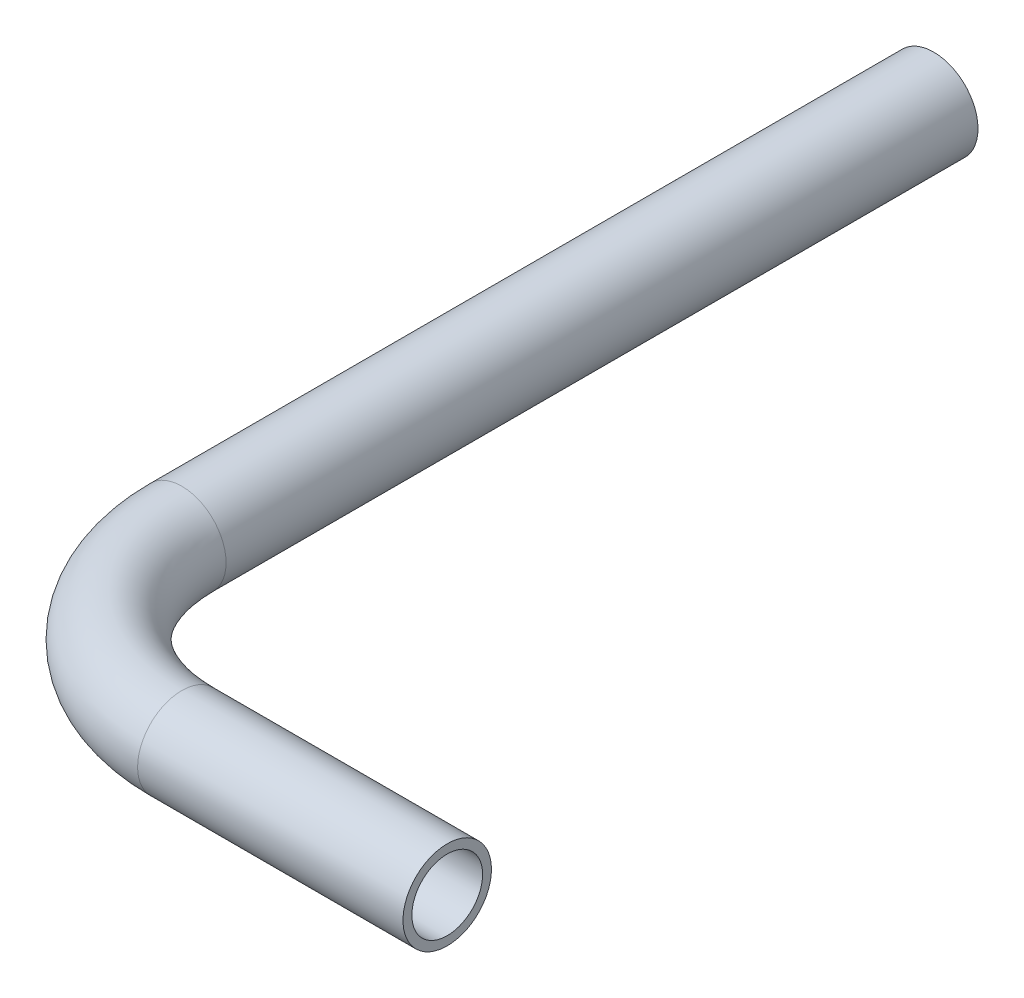
ISO-10303-21;
HEADER;
FILE_DESCRIPTION(('STEP AP214'),'2;1');
FILE_NAME('part.step','',(''),(''),'','','');
FILE_SCHEMA(('AUTOMOTIVE_DESIGN { 1 0 10303 214 1 1 1 1 }'));
ENDSEC;
DATA;
#1=APPLICATION_CONTEXT('core data for automotive mechanical design processes');
#2=APPLICATION_PROTOCOL_DEFINITION('international standard','automotive_design',2000,#1);
#3=PRODUCT_CONTEXT('',#1,'mechanical');
#4=PRODUCT('Part','Part','',(#3));
#5=PRODUCT_RELATED_PRODUCT_CATEGORY('part','',(#4));
#6=PRODUCT_DEFINITION_FORMATION('','',#4);
#7=PRODUCT_DEFINITION_CONTEXT('part definition',#1,'design');
#8=PRODUCT_DEFINITION('design','',#6,#7);
#9=PRODUCT_DEFINITION_SHAPE('','',#8);
#10=(LENGTH_UNIT() NAMED_UNIT(*) SI_UNIT(.MILLI.,.METRE.));
#11=(NAMED_UNIT(*) PLANE_ANGLE_UNIT() SI_UNIT($,.RADIAN.));
#12=(NAMED_UNIT(*) SI_UNIT($,.STERADIAN.) SOLID_ANGLE_UNIT());
#13=UNCERTAINTY_MEASURE_WITH_UNIT(LENGTH_MEASURE(1.E-05),#10,'distance_accuracy_value','');
#14=(GEOMETRIC_REPRESENTATION_CONTEXT(3) GLOBAL_UNCERTAINTY_ASSIGNED_CONTEXT((#13)) GLOBAL_UNIT_ASSIGNED_CONTEXT((#10,
#11,#12)) REPRESENTATION_CONTEXT('',''));
#15=CARTESIAN_POINT('',(0.,0.,0.));
#16=DIRECTION('',(0.,0.,1.));
#17=DIRECTION('',(1.,0.,0.));
#18=AXIS2_PLACEMENT_3D('',#15,#16,#17);
#19=CARTESIAN_POINT('',(0.,0.,0.));
#20=DIRECTION('',(0.,0.,1.));
#21=DIRECTION('',(1.,0.,0.));
#22=AXIS2_PLACEMENT_3D('',#19,#20,#21);
#23=PLANE('',#22);
#24=CARTESIAN_POINT('',(0.,0.,0.));
#25=DIRECTION('',(0.,0.,1.));
#26=DIRECTION('',(1.,0.,0.));
#27=AXIS2_PLACEMENT_3D('',#24,#25,#26);
#28=CIRCLE('',#27,5.08);
#29=CARTESIAN_POINT('',(5.08,0.,0.));
#30=VERTEX_POINT('',#29);
#31=EDGE_CURVE('E53',#30,#30,#28,.T.);
#32=ORIENTED_EDGE('',*,*,#31,.T.);
#33=EDGE_LOOP('',(#32));
#34=FACE_BOUND('',#33,.T.);
#35=CARTESIAN_POINT('',(0.,0.,0.));
#36=DIRECTION('',(0.,0.,1.));
#37=DIRECTION('',(1.,0.,0.));
#38=AXIS2_PLACEMENT_3D('',#35,#36,#37);
#39=CIRCLE('',#38,6.35);
#40=CARTESIAN_POINT('',(6.35,0.,0.));
#41=VERTEX_POINT('',#40);
#42=EDGE_CURVE('E44',#41,#41,#39,.T.);
#43=ORIENTED_EDGE('',*,*,#42,.F.);
#44=EDGE_LOOP('',(#43));
#45=FACE_BOUND('',#44,.T.);
#46=ADVANCED_FACE('F30',(#34,#45),#23,.F.);
#47=CARTESIAN_POINT('',(63.5,0.,133.35));
#48=DIRECTION('',(1.,0.,0.));
#49=DIRECTION('',(0.,0.,-1.));
#50=AXIS2_PLACEMENT_3D('',#47,#48,#49);
#51=PLANE('',#50);
#52=CARTESIAN_POINT('',(63.5,0.,133.35));
#53=DIRECTION('',(1.,0.,0.));
#54=DIRECTION('',(0.,0.,-1.));
#55=AXIS2_PLACEMENT_3D('',#52,#53,#54);
#56=CIRCLE('',#55,5.08);
#57=CARTESIAN_POINT('',(63.5,0.,128.27));
#58=VERTEX_POINT('',#57);
#59=EDGE_CURVE('E49',#58,#58,#56,.T.);
#60=ORIENTED_EDGE('',*,*,#59,.F.);
#61=EDGE_LOOP('',(#60));
#62=FACE_BOUND('',#61,.T.);
#63=CARTESIAN_POINT('',(63.5,0.,133.35));
#64=DIRECTION('',(1.,0.,0.));
#65=DIRECTION('',(0.,0.,-1.));
#66=AXIS2_PLACEMENT_3D('',#63,#64,#65);
#67=CIRCLE('',#66,6.35);
#68=CARTESIAN_POINT('',(63.5,0.,127.));
#69=VERTEX_POINT('',#68);
#70=EDGE_CURVE('E10',#69,#69,#67,.T.);
#71=ORIENTED_EDGE('',*,*,#70,.T.);
#72=EDGE_LOOP('',(#71));
#73=FACE_BOUND('',#72,.T.);
#74=ADVANCED_FACE('F89',(#62,#73),#51,.T.);
#75=CARTESIAN_POINT('',(0.,0.,0.));
#76=DIRECTION('',(0.,0.,1.));
#77=DIRECTION('',(1.,0.,0.));
#78=AXIS2_PLACEMENT_3D('',#75,#76,#77);
#79=CYLINDRICAL_SURFACE('',#78,6.35);
#80=CARTESIAN_POINT('',(0.,0.,107.95));
#81=DIRECTION('',(0.,0.,1.));
#82=DIRECTION('',(1.,0.,0.));
#83=AXIS2_PLACEMENT_3D('',#80,#81,#82);
#84=CIRCLE('',#83,6.35);
#85=CARTESIAN_POINT('',(-6.34999999999998,0.,107.95));
#86=VERTEX_POINT('',#85);
#87=EDGE_CURVE('E40',#86,#86,#84,.T.);
#88=ORIENTED_EDGE('',*,*,#87,.F.);
#89=EDGE_LOOP('',(#88));
#90=FACE_BOUND('',#89,.T.);
#91=ORIENTED_EDGE('',*,*,#42,.T.);
#92=EDGE_LOOP('',(#91));
#93=FACE_BOUND('',#92,.T.);
#94=ADVANCED_FACE('F85',(#90,#93),#79,.T.);
#95=CARTESIAN_POINT('',(25.4,0.,107.95));
#96=DIRECTION('',(0.,1.,0.));
#97=DIRECTION('',(0.,0.,1.));
#98=AXIS2_PLACEMENT_3D('',#95,#96,#97);
#99=TOROIDAL_SURFACE('',#98,25.4,6.35);
#100=CARTESIAN_POINT('',(25.4,0.,133.35));
#101=DIRECTION('',(1.,0.,0.));
#102=DIRECTION('',(0.,0.,-1.));
#103=AXIS2_PLACEMENT_3D('',#100,#101,#102);
#104=CIRCLE('',#103,6.35);
#105=CARTESIAN_POINT('',(25.4,0.,139.7));
#106=VERTEX_POINT('',#105);
#107=EDGE_CURVE('E36',#106,#106,#104,.T.);
#108=CARTESIAN_POINT('',(25.4,0.,107.95));
#109=DIRECTION('',(0.,1.,0.));
#110=DIRECTION('',(0.,0.,1.));
#111=AXIS2_PLACEMENT_3D('',#108,#109,#110);
#112=CIRCLE('',#111,31.75);
#113=EDGE_CURVE('',#86,#106,#112,.T.);
#114=ORIENTED_EDGE('',*,*,#87,.T.);
#115=ORIENTED_EDGE('',*,*,#107,.F.);
#116=ORIENTED_EDGE('',*,*,#113,.T.);
#117=ORIENTED_EDGE('',*,*,#113,.F.);
#118=EDGE_LOOP('',(#114,#116,#115,#117));
#119=FACE_BOUND('',#118,.T.);
#120=ADVANCED_FACE('F79',(#119),#99,.T.);
#121=CARTESIAN_POINT('',(25.4,0.,133.35));
#122=DIRECTION('',(1.,0.,0.));
#123=DIRECTION('',(0.,0.,-1.));
#124=AXIS2_PLACEMENT_3D('',#121,#122,#123);
#125=CYLINDRICAL_SURFACE('',#124,6.35);
#126=ORIENTED_EDGE('',*,*,#70,.F.);
#127=EDGE_LOOP('',(#126));
#128=FACE_BOUND('',#127,.T.);
#129=ORIENTED_EDGE('',*,*,#107,.T.);
#130=EDGE_LOOP('',(#129));
#131=FACE_BOUND('',#130,.T.);
#132=ADVANCED_FACE('F76',(#128,#131),#125,.T.);
#133=CARTESIAN_POINT('',(0.,0.,0.));
#134=DIRECTION('',(0.,0.,1.));
#135=DIRECTION('',(1.,0.,0.));
#136=AXIS2_PLACEMENT_3D('',#133,#134,#135);
#137=CYLINDRICAL_SURFACE('',#136,5.08);
#138=CARTESIAN_POINT('',(0.,0.,107.95));
#139=DIRECTION('',(0.,0.,-1.));
#140=DIRECTION('',(-1.,0.,0.));
#141=AXIS2_PLACEMENT_3D('',#138,#139,#140);
#142=CIRCLE('',#141,5.08);
#143=CARTESIAN_POINT('',(-5.07999999999999,0.,107.95));
#144=VERTEX_POINT('',#143);
#145=EDGE_CURVE('E56',#144,#144,#142,.F.);
#146=ORIENTED_EDGE('',*,*,#145,.T.);
#147=EDGE_LOOP('',(#146));
#148=FACE_BOUND('',#147,.T.);
#149=ORIENTED_EDGE('',*,*,#31,.F.);
#150=EDGE_LOOP('',(#149));
#151=FACE_BOUND('',#150,.T.);
#152=ADVANCED_FACE('F62',(#148,#151),#137,.F.);
#153=CARTESIAN_POINT('',(25.4,0.,107.95));
#154=DIRECTION('',(0.,1.,0.));
#155=DIRECTION('',(0.,0.,1.));
#156=AXIS2_PLACEMENT_3D('',#153,#154,#155);
#157=TOROIDAL_SURFACE('',#156,25.4,5.08);
#158=CARTESIAN_POINT('',(25.4,0.,133.35));
#159=DIRECTION('',(1.,0.,0.));
#160=DIRECTION('',(0.,0.,-1.));
#161=AXIS2_PLACEMENT_3D('',#158,#159,#160);
#162=CIRCLE('',#161,5.08);
#163=CARTESIAN_POINT('',(25.4,0.,138.43));
#164=VERTEX_POINT('',#163);
#165=EDGE_CURVE('E52',#164,#164,#162,.T.);
#166=CARTESIAN_POINT('',(25.4,0.,107.95));
#167=DIRECTION('',(0.,1.,0.));
#168=DIRECTION('',(0.,0.,1.));
#169=AXIS2_PLACEMENT_3D('',#166,#167,#168);
#170=CIRCLE('',#169,30.48);
#171=EDGE_CURVE('',#144,#164,#170,.T.);
#172=ORIENTED_EDGE('',*,*,#145,.F.);
#173=ORIENTED_EDGE('',*,*,#165,.T.);
#174=ORIENTED_EDGE('',*,*,#171,.T.);
#175=ORIENTED_EDGE('',*,*,#171,.F.);
#176=EDGE_LOOP('',(#172,#174,#173,#175));
#177=FACE_BOUND('',#176,.T.);
#178=ADVANCED_FACE('F65',(#177),#157,.F.);
#179=CARTESIAN_POINT('',(25.4,0.,133.35));
#180=DIRECTION('',(1.,0.,0.));
#181=DIRECTION('',(0.,0.,-1.));
#182=AXIS2_PLACEMENT_3D('',#179,#180,#181);
#183=CYLINDRICAL_SURFACE('',#182,5.08);
#184=ORIENTED_EDGE('',*,*,#59,.T.);
#185=EDGE_LOOP('',(#184));
#186=FACE_BOUND('',#185,.T.);
#187=ORIENTED_EDGE('',*,*,#165,.F.);
#188=EDGE_LOOP('',(#187));
#189=FACE_BOUND('',#188,.T.);
#190=ADVANCED_FACE('F67',(#186,#189),#183,.F.);
#191=CLOSED_SHELL('',(#46,#74,#94,#120,#132,#152,#178,#190));
#192=MANIFOLD_SOLID_BREP('B2',#191);
#193=ADVANCED_BREP_SHAPE_REPRESENTATION('',(#18,#192),#14);
#194=SHAPE_DEFINITION_REPRESENTATION(#9,#193);
ENDSEC;
END-ISO-10303-21;
